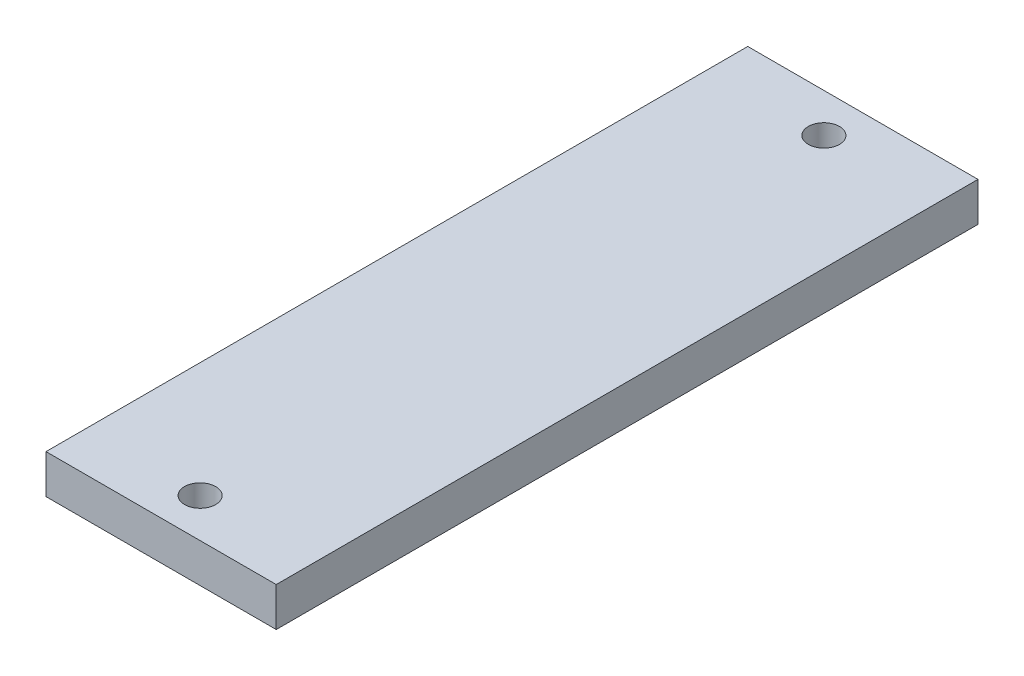
ISO-10303-21;
HEADER;
FILE_DESCRIPTION(('STEP AP214'),'2;1');
FILE_NAME('part.step','',(''),(''),'','','');
FILE_SCHEMA(('AUTOMOTIVE_DESIGN { 1 0 10303 214 1 1 1 1 }'));
ENDSEC;
DATA;
#1=APPLICATION_CONTEXT('core data for automotive mechanical design processes');
#2=APPLICATION_PROTOCOL_DEFINITION('international standard','automotive_design',2000,#1);
#3=PRODUCT_CONTEXT('',#1,'mechanical');
#4=PRODUCT('Part','Part','',(#3));
#5=PRODUCT_RELATED_PRODUCT_CATEGORY('part','',(#4));
#6=PRODUCT_DEFINITION_FORMATION('','',#4);
#7=PRODUCT_DEFINITION_CONTEXT('part definition',#1,'design');
#8=PRODUCT_DEFINITION('design','',#6,#7);
#9=PRODUCT_DEFINITION_SHAPE('','',#8);
#10=(LENGTH_UNIT() NAMED_UNIT(*) SI_UNIT(.MILLI.,.METRE.));
#11=(NAMED_UNIT(*) PLANE_ANGLE_UNIT() SI_UNIT($,.RADIAN.));
#12=(NAMED_UNIT(*) SI_UNIT($,.STERADIAN.) SOLID_ANGLE_UNIT());
#13=UNCERTAINTY_MEASURE_WITH_UNIT(LENGTH_MEASURE(1.E-05),#10,'distance_accuracy_value','');
#14=(GEOMETRIC_REPRESENTATION_CONTEXT(3) GLOBAL_UNCERTAINTY_ASSIGNED_CONTEXT((#13)) GLOBAL_UNIT_ASSIGNED_CONTEXT((#10,
#11,#12)) REPRESENTATION_CONTEXT('',''));
#15=CARTESIAN_POINT('',(0.,0.,0.));
#16=DIRECTION('',(0.,0.,1.));
#17=DIRECTION('',(1.,0.,0.));
#18=AXIS2_PLACEMENT_3D('',#15,#16,#17);
#19=CARTESIAN_POINT('',(18.75,6.35,57.15));
#20=DIRECTION('',(-1.,0.,0.));
#21=DIRECTION('',(0.,0.,1.));
#22=AXIS2_PLACEMENT_3D('',#19,#20,#21);
#23=PLANE('',#22);
#24=DIRECTION('',(0.,0.,-1.));
#25=VECTOR('',#24,1.);
#26=CARTESIAN_POINT('',(18.75,0.,57.15));
#27=LINE('',#26,#25);
#28=CARTESIAN_POINT('',(18.75,0.,57.15));
#29=VERTEX_POINT('',#28);
#30=CARTESIAN_POINT('',(18.75,0.,-57.15));
#31=VERTEX_POINT('',#30);
#32=EDGE_CURVE('E114',#29,#31,#27,.T.);
#33=ORIENTED_EDGE('',*,*,#32,.T.);
#34=DIRECTION('',(0.,-1.,0.));
#35=VECTOR('',#34,1.);
#36=CARTESIAN_POINT('',(18.75,6.35,-57.15));
#37=LINE('',#36,#35);
#38=CARTESIAN_POINT('',(18.75,6.35,-57.15));
#39=VERTEX_POINT('',#38);
#40=EDGE_CURVE('E11',#39,#31,#37,.T.);
#41=ORIENTED_EDGE('',*,*,#40,.F.);
#42=DIRECTION('',(0.,0.,-1.));
#43=VECTOR('',#42,1.);
#44=CARTESIAN_POINT('',(18.75,6.35,57.15));
#45=LINE('',#44,#43);
#46=CARTESIAN_POINT('',(18.75,6.35,57.15));
#47=VERTEX_POINT('',#46);
#48=EDGE_CURVE('E97',#47,#39,#45,.T.);
#49=ORIENTED_EDGE('',*,*,#48,.F.);
#50=DIRECTION('',(0.,-1.,0.));
#51=VECTOR('',#50,1.);
#52=CARTESIAN_POINT('',(18.75,6.35,57.15));
#53=LINE('',#52,#51);
#54=EDGE_CURVE('E110',#47,#29,#53,.T.);
#55=ORIENTED_EDGE('',*,*,#54,.T.);
#56=EDGE_LOOP('',(#33,#41,#49,#55));
#57=FACE_BOUND('',#56,.T.);
#58=ADVANCED_FACE('F43',(#57),#23,.F.);
#59=CARTESIAN_POINT('',(-18.75,6.35,-57.15));
#60=DIRECTION('',(0.,0.,1.));
#61=DIRECTION('',(1.,0.,0.));
#62=AXIS2_PLACEMENT_3D('',#59,#60,#61);
#63=PLANE('',#62);
#64=DIRECTION('',(-1.,0.,0.));
#65=VECTOR('',#64,1.);
#66=CARTESIAN_POINT('',(-18.75,0.,-57.15));
#67=LINE('',#66,#65);
#68=CARTESIAN_POINT('',(-18.75,0.,-57.15));
#69=VERTEX_POINT('',#68);
#70=EDGE_CURVE('E102',#31,#69,#67,.T.);
#71=ORIENTED_EDGE('',*,*,#70,.T.);
#72=DIRECTION('',(0.,-1.,0.));
#73=VECTOR('',#72,1.);
#74=CARTESIAN_POINT('',(-18.75,6.35,-57.15));
#75=LINE('',#74,#73);
#76=CARTESIAN_POINT('',(-18.75,6.35,-57.15));
#77=VERTEX_POINT('',#76);
#78=EDGE_CURVE('E53',#77,#69,#75,.T.);
#79=ORIENTED_EDGE('',*,*,#78,.F.);
#80=DIRECTION('',(-1.,0.,0.));
#81=VECTOR('',#80,1.);
#82=CARTESIAN_POINT('',(-18.75,6.35,-57.15));
#83=LINE('',#82,#81);
#84=EDGE_CURVE('E92',#39,#77,#83,.T.);
#85=ORIENTED_EDGE('',*,*,#84,.F.);
#86=ORIENTED_EDGE('',*,*,#40,.T.);
#87=EDGE_LOOP('',(#71,#79,#85,#86));
#88=FACE_BOUND('',#87,.T.);
#89=ADVANCED_FACE('F101',(#88),#63,.F.);
#90=CARTESIAN_POINT('',(-18.75,6.35,57.15));
#91=DIRECTION('',(1.,0.,0.));
#92=DIRECTION('',(0.,0.,-1.));
#93=AXIS2_PLACEMENT_3D('',#90,#91,#92);
#94=PLANE('',#93);
#95=DIRECTION('',(0.,0.,1.));
#96=VECTOR('',#95,1.);
#97=CARTESIAN_POINT('',(-18.75,0.,57.15));
#98=LINE('',#97,#96);
#99=CARTESIAN_POINT('',(-18.75,0.,57.15));
#100=VERTEX_POINT('',#99);
#101=EDGE_CURVE('E79',#69,#100,#98,.T.);
#102=ORIENTED_EDGE('',*,*,#101,.T.);
#103=DIRECTION('',(0.,-1.,0.));
#104=VECTOR('',#103,1.);
#105=CARTESIAN_POINT('',(-18.75,6.35,57.15));
#106=LINE('',#105,#104);
#107=CARTESIAN_POINT('',(-18.75,6.35,57.15));
#108=VERTEX_POINT('',#107);
#109=EDGE_CURVE('E104',#108,#100,#106,.T.);
#110=ORIENTED_EDGE('',*,*,#109,.F.);
#111=DIRECTION('',(0.,0.,1.));
#112=VECTOR('',#111,1.);
#113=CARTESIAN_POINT('',(-18.75,6.35,57.15));
#114=LINE('',#113,#112);
#115=EDGE_CURVE('E95',#77,#108,#114,.T.);
#116=ORIENTED_EDGE('',*,*,#115,.F.);
#117=ORIENTED_EDGE('',*,*,#78,.T.);
#118=EDGE_LOOP('',(#102,#110,#116,#117));
#119=FACE_BOUND('',#118,.T.);
#120=ADVANCED_FACE('F106',(#119),#94,.F.);
#121=CARTESIAN_POINT('',(-18.75,6.35,57.15));
#122=DIRECTION('',(0.,0.,-1.));
#123=DIRECTION('',(-1.,0.,0.));
#124=AXIS2_PLACEMENT_3D('',#121,#122,#123);
#125=PLANE('',#124);
#126=DIRECTION('',(1.,0.,0.));
#127=VECTOR('',#126,1.);
#128=CARTESIAN_POINT('',(-18.75,0.,57.15));
#129=LINE('',#128,#127);
#130=EDGE_CURVE('E85',#100,#29,#129,.T.);
#131=ORIENTED_EDGE('',*,*,#130,.T.);
#132=ORIENTED_EDGE('',*,*,#54,.F.);
#133=DIRECTION('',(1.,0.,0.));
#134=VECTOR('',#133,1.);
#135=CARTESIAN_POINT('',(-18.75,6.35,57.15));
#136=LINE('',#135,#134);
#137=EDGE_CURVE('E62',#108,#47,#136,.T.);
#138=ORIENTED_EDGE('',*,*,#137,.F.);
#139=ORIENTED_EDGE('',*,*,#109,.T.);
#140=EDGE_LOOP('',(#131,#132,#138,#139));
#141=FACE_BOUND('',#140,.T.);
#142=ADVANCED_FACE('F151',(#141),#125,.F.);
#143=CARTESIAN_POINT('',(0.,6.35,0.));
#144=DIRECTION('',(0.,-1.,0.));
#145=DIRECTION('',(0.,0.,-1.));
#146=AXIS2_PLACEMENT_3D('',#143,#144,#145);
#147=PLANE('',#146);
#148=CARTESIAN_POINT('',(0.,6.35,-50.8));
#149=DIRECTION('',(0.,1.,0.));
#150=DIRECTION('',(0.,0.,1.));
#151=AXIS2_PLACEMENT_3D('',#148,#149,#150);
#152=CIRCLE('',#151,2.54);
#153=CARTESIAN_POINT('',(0.,6.35,-48.26));
#154=VERTEX_POINT('',#153);
#155=EDGE_CURVE('E130',#154,#154,#152,.T.);
#156=ORIENTED_EDGE('',*,*,#155,.F.);
#157=EDGE_LOOP('',(#156));
#158=FACE_BOUND('',#157,.T.);
#159=CARTESIAN_POINT('',(0.,6.35,50.8));
#160=DIRECTION('',(0.,1.,0.));
#161=DIRECTION('',(0.,0.,-1.));
#162=AXIS2_PLACEMENT_3D('',#159,#160,#161);
#163=CIRCLE('',#162,2.54);
#164=CARTESIAN_POINT('',(0.,6.35,53.34));
#165=VERTEX_POINT('',#164);
#166=EDGE_CURVE('E137',#165,#165,#163,.T.);
#167=ORIENTED_EDGE('',*,*,#166,.F.);
#168=EDGE_LOOP('',(#167));
#169=FACE_BOUND('',#168,.T.);
#170=ORIENTED_EDGE('',*,*,#48,.T.);
#171=ORIENTED_EDGE('',*,*,#84,.T.);
#172=ORIENTED_EDGE('',*,*,#115,.T.);
#173=ORIENTED_EDGE('',*,*,#137,.T.);
#174=EDGE_LOOP('',(#170,#171,#172,#173));
#175=FACE_BOUND('',#174,.T.);
#176=ADVANCED_FACE('F93',(#158,#169,#175),#147,.F.);
#177=CARTESIAN_POINT('',(0.,0.,0.));
#178=DIRECTION('',(0.,-1.,0.));
#179=DIRECTION('',(0.,0.,-1.));
#180=AXIS2_PLACEMENT_3D('',#177,#178,#179);
#181=PLANE('',#180);
#182=CARTESIAN_POINT('',(0.,0.,-50.8));
#183=DIRECTION('',(0.,-1.,0.));
#184=DIRECTION('',(0.,0.,-1.));
#185=AXIS2_PLACEMENT_3D('',#182,#183,#184);
#186=CIRCLE('',#185,2.54);
#187=CARTESIAN_POINT('',(0.,0.,-48.26));
#188=VERTEX_POINT('',#187);
#189=EDGE_CURVE('E46',#188,#188,#186,.T.);
#190=ORIENTED_EDGE('',*,*,#189,.F.);
#191=EDGE_LOOP('',(#190));
#192=FACE_BOUND('',#191,.T.);
#193=CARTESIAN_POINT('',(0.,0.,50.8));
#194=DIRECTION('',(0.,-1.,0.));
#195=DIRECTION('',(0.,0.,-1.));
#196=AXIS2_PLACEMENT_3D('',#193,#194,#195);
#197=CIRCLE('',#196,2.54);
#198=CARTESIAN_POINT('',(0.,0.,53.34));
#199=VERTEX_POINT('',#198);
#200=EDGE_CURVE('E127',#199,#199,#197,.T.);
#201=ORIENTED_EDGE('',*,*,#200,.F.);
#202=EDGE_LOOP('',(#201));
#203=FACE_BOUND('',#202,.T.);
#204=ORIENTED_EDGE('',*,*,#32,.F.);
#205=ORIENTED_EDGE('',*,*,#130,.F.);
#206=ORIENTED_EDGE('',*,*,#101,.F.);
#207=ORIENTED_EDGE('',*,*,#70,.F.);
#208=EDGE_LOOP('',(#204,#205,#206,#207));
#209=FACE_BOUND('',#208,.T.);
#210=ADVANCED_FACE('F150',(#192,#203,#209),#181,.T.);
#211=CARTESIAN_POINT('',(0.,-3.175,50.8));
#212=DIRECTION('',(0.,1.,0.));
#213=DIRECTION('',(0.,0.,1.));
#214=AXIS2_PLACEMENT_3D('',#211,#212,#213);
#215=CYLINDRICAL_SURFACE('',#214,2.54);
#216=CARTESIAN_POINT('',(0.,0.,53.34));
#217=CARTESIAN_POINT('',(0.,0.0661458333333336,53.34));
#218=CARTESIAN_POINT('',(0.,0.132291666666667,53.34));
#219=CARTESIAN_POINT('',(0.,0.264583333333334,53.34));
#220=CARTESIAN_POINT('',(0.,0.330729166666667,53.34));
#221=CARTESIAN_POINT('',(0.,0.463020833333334,53.34));
#222=CARTESIAN_POINT('',(0.,0.529166666666667,53.34));
#223=CARTESIAN_POINT('',(0.,0.661458333333334,53.34));
#224=CARTESIAN_POINT('',(0.,0.727604166666667,53.34));
#225=CARTESIAN_POINT('',(0.,0.859895833333333,53.34));
#226=CARTESIAN_POINT('',(0.,0.926041666666667,53.34));
#227=CARTESIAN_POINT('',(0.,1.05833333333333,53.34));
#228=CARTESIAN_POINT('',(0.,1.12447916666667,53.34));
#229=CARTESIAN_POINT('',(0.,1.25677083333333,53.34));
#230=CARTESIAN_POINT('',(0.,1.32291666666667,53.34));
#231=CARTESIAN_POINT('',(0.,1.45520833333333,53.34));
#232=CARTESIAN_POINT('',(0.,1.52135416666667,53.34));
#233=CARTESIAN_POINT('',(0.,1.65364583333333,53.34));
#234=CARTESIAN_POINT('',(0.,1.71979166666667,53.34));
#235=CARTESIAN_POINT('',(0.,1.85208333333333,53.34));
#236=CARTESIAN_POINT('',(0.,1.91822916666667,53.34));
#237=CARTESIAN_POINT('',(0.,2.05052083333333,53.34));
#238=CARTESIAN_POINT('',(0.,2.11666666666667,53.34));
#239=CARTESIAN_POINT('',(0.,2.24895833333333,53.34));
#240=CARTESIAN_POINT('',(0.,2.31510416666667,53.34));
#241=CARTESIAN_POINT('',(0.,2.44739583333333,53.34));
#242=CARTESIAN_POINT('',(0.,2.51354166666667,53.34));
#243=CARTESIAN_POINT('',(0.,2.64583333333333,53.34));
#244=CARTESIAN_POINT('',(0.,2.71197916666667,53.34));
#245=CARTESIAN_POINT('',(0.,2.84427083333333,53.34));
#246=CARTESIAN_POINT('',(0.,2.91041666666667,53.34));
#247=CARTESIAN_POINT('',(0.,3.04270833333333,53.34));
#248=CARTESIAN_POINT('',(0.,3.10885416666667,53.34));
#249=CARTESIAN_POINT('',(0.,3.24114583333333,53.34));
#250=CARTESIAN_POINT('',(0.,3.30729166666667,53.34));
#251=CARTESIAN_POINT('',(0.,3.43958333333333,53.34));
#252=CARTESIAN_POINT('',(0.,3.50572916666667,53.34));
#253=CARTESIAN_POINT('',(0.,3.63802083333333,53.34));
#254=CARTESIAN_POINT('',(0.,3.70416666666667,53.34));
#255=CARTESIAN_POINT('',(0.,3.83645833333333,53.34));
#256=CARTESIAN_POINT('',(0.,3.90260416666667,53.34));
#257=CARTESIAN_POINT('',(0.,4.03489583333333,53.34));
#258=CARTESIAN_POINT('',(0.,4.10104166666667,53.34));
#259=CARTESIAN_POINT('',(0.,4.23333333333333,53.34));
#260=CARTESIAN_POINT('',(0.,4.29947916666667,53.34));
#261=CARTESIAN_POINT('',(0.,4.43177083333333,53.34));
#262=CARTESIAN_POINT('',(0.,4.49791666666667,53.34));
#263=CARTESIAN_POINT('',(0.,4.63020833333333,53.34));
#264=CARTESIAN_POINT('',(0.,4.69635416666667,53.34));
#265=CARTESIAN_POINT('',(0.,4.82864583333333,53.34));
#266=CARTESIAN_POINT('',(0.,4.89479166666667,53.34));
#267=CARTESIAN_POINT('',(0.,5.02708333333333,53.34));
#268=CARTESIAN_POINT('',(0.,5.09322916666667,53.34));
#269=CARTESIAN_POINT('',(0.,5.22552083333333,53.34));
#270=CARTESIAN_POINT('',(0.,5.29166666666667,53.34));
#271=CARTESIAN_POINT('',(0.,5.42395833333333,53.34));
#272=CARTESIAN_POINT('',(0.,5.49010416666667,53.34));
#273=CARTESIAN_POINT('',(0.,5.62239583333333,53.34));
#274=CARTESIAN_POINT('',(0.,5.68854166666667,53.34));
#275=CARTESIAN_POINT('',(0.,5.82083333333333,53.34));
#276=CARTESIAN_POINT('',(0.,5.88697916666667,53.34));
#277=CARTESIAN_POINT('',(0.,6.01927083333333,53.34));
#278=CARTESIAN_POINT('',(0.,6.08541666666667,53.34));
#279=CARTESIAN_POINT('',(0.,6.21770833333333,53.34));
#280=CARTESIAN_POINT('',(0.,6.28385416666667,53.34));
#281=CARTESIAN_POINT('',(0.,6.35,53.34));
#282=B_SPLINE_CURVE_WITH_KNOTS('',3,(#216,#217,#218,#219,#220,#221,#222,#223,#224,#225,#226,
#227,#228,#229,#230,#231,#232,#233,#234,#235,#236,#237,#238,#239,#240,#241,#242,#243,#244,#245,
#246,#247,#248,#249,#250,#251,#252,#253,#254,#255,#256,#257,#258,#259,#260,#261,#262,#263,#264,
#265,#266,#267,#268,#269,#270,#271,#272,#273,#274,#275,#276,#277,#278,#279,#280,#281),
.UNSPECIFIED.,.F.,.F.,(4,2,2,2,2,2,2,2,2,2,2,2,2,2,2,2,2,2,2,2,2,2,2,2,2,2,2,2,2,2,2,2,4),(0.,
0.1984375,0.396875,0.5953125,0.79375,0.9921875,1.190625,1.3890625,1.5875,1.7859375,1.984375,
2.1828125,2.38125,2.5796875,2.778125,2.9765625,3.175,3.3734375,3.571875,3.7703125,3.96875,
4.1671875,4.365625,4.5640625,4.7625,4.9609375,5.159375,5.3578125,5.55625,5.7546875,5.953125,
6.1515625,6.35),.UNSPECIFIED.);
#283=EDGE_CURVE('BSEAM147',#199,#165,#282,.T.);
#284=ORIENTED_EDGE('',*,*,#200,.T.);
#285=ORIENTED_EDGE('',*,*,#166,.T.);
#286=ORIENTED_EDGE('',*,*,#283,.T.);
#287=ORIENTED_EDGE('',*,*,#283,.F.);
#288=EDGE_LOOP('',(#284,#286,#285,#287));
#289=FACE_BOUND('',#288,.T.);
#290=ADVANCED_FACE('F147',(#289),#215,.F.);
#291=CARTESIAN_POINT('',(0.,-3.175,-50.8));
#292=DIRECTION('',(0.,1.,0.));
#293=DIRECTION('',(0.,0.,1.));
#294=AXIS2_PLACEMENT_3D('',#291,#292,#293);
#295=CYLINDRICAL_SURFACE('',#294,2.54);
#296=CARTESIAN_POINT('',(0.,0.,-48.26));
#297=CARTESIAN_POINT('',(0.,0.0661458333333336,-48.26));
#298=CARTESIAN_POINT('',(0.,0.132291666666667,-48.26));
#299=CARTESIAN_POINT('',(0.,0.264583333333334,-48.26));
#300=CARTESIAN_POINT('',(0.,0.330729166666667,-48.26));
#301=CARTESIAN_POINT('',(0.,0.463020833333334,-48.26));
#302=CARTESIAN_POINT('',(0.,0.529166666666667,-48.26));
#303=CARTESIAN_POINT('',(0.,0.661458333333334,-48.26));
#304=CARTESIAN_POINT('',(0.,0.727604166666667,-48.26));
#305=CARTESIAN_POINT('',(0.,0.859895833333333,-48.26));
#306=CARTESIAN_POINT('',(0.,0.926041666666667,-48.26));
#307=CARTESIAN_POINT('',(0.,1.05833333333333,-48.26));
#308=CARTESIAN_POINT('',(0.,1.12447916666667,-48.26));
#309=CARTESIAN_POINT('',(0.,1.25677083333333,-48.26));
#310=CARTESIAN_POINT('',(0.,1.32291666666667,-48.26));
#311=CARTESIAN_POINT('',(0.,1.45520833333333,-48.26));
#312=CARTESIAN_POINT('',(0.,1.52135416666667,-48.26));
#313=CARTESIAN_POINT('',(0.,1.65364583333333,-48.26));
#314=CARTESIAN_POINT('',(0.,1.71979166666667,-48.26));
#315=CARTESIAN_POINT('',(0.,1.85208333333333,-48.26));
#316=CARTESIAN_POINT('',(0.,1.91822916666667,-48.26));
#317=CARTESIAN_POINT('',(0.,2.05052083333333,-48.26));
#318=CARTESIAN_POINT('',(0.,2.11666666666667,-48.26));
#319=CARTESIAN_POINT('',(0.,2.24895833333333,-48.26));
#320=CARTESIAN_POINT('',(0.,2.31510416666667,-48.26));
#321=CARTESIAN_POINT('',(0.,2.44739583333333,-48.26));
#322=CARTESIAN_POINT('',(0.,2.51354166666667,-48.26));
#323=CARTESIAN_POINT('',(0.,2.64583333333333,-48.26));
#324=CARTESIAN_POINT('',(0.,2.71197916666667,-48.26));
#325=CARTESIAN_POINT('',(0.,2.84427083333333,-48.26));
#326=CARTESIAN_POINT('',(0.,2.91041666666667,-48.26));
#327=CARTESIAN_POINT('',(0.,3.04270833333333,-48.26));
#328=CARTESIAN_POINT('',(0.,3.10885416666667,-48.26));
#329=CARTESIAN_POINT('',(0.,3.24114583333333,-48.26));
#330=CARTESIAN_POINT('',(0.,3.30729166666667,-48.26));
#331=CARTESIAN_POINT('',(0.,3.43958333333333,-48.26));
#332=CARTESIAN_POINT('',(0.,3.50572916666667,-48.26));
#333=CARTESIAN_POINT('',(0.,3.63802083333333,-48.26));
#334=CARTESIAN_POINT('',(0.,3.70416666666667,-48.26));
#335=CARTESIAN_POINT('',(0.,3.83645833333333,-48.26));
#336=CARTESIAN_POINT('',(0.,3.90260416666667,-48.26));
#337=CARTESIAN_POINT('',(0.,4.03489583333333,-48.26));
#338=CARTESIAN_POINT('',(0.,4.10104166666667,-48.26));
#339=CARTESIAN_POINT('',(0.,4.23333333333333,-48.26));
#340=CARTESIAN_POINT('',(0.,4.29947916666667,-48.26));
#341=CARTESIAN_POINT('',(0.,4.43177083333333,-48.26));
#342=CARTESIAN_POINT('',(0.,4.49791666666667,-48.26));
#343=CARTESIAN_POINT('',(0.,4.63020833333333,-48.26));
#344=CARTESIAN_POINT('',(0.,4.69635416666667,-48.26));
#345=CARTESIAN_POINT('',(0.,4.82864583333333,-48.26));
#346=CARTESIAN_POINT('',(0.,4.89479166666667,-48.26));
#347=CARTESIAN_POINT('',(0.,5.02708333333333,-48.26));
#348=CARTESIAN_POINT('',(0.,5.09322916666667,-48.26));
#349=CARTESIAN_POINT('',(0.,5.22552083333333,-48.26));
#350=CARTESIAN_POINT('',(0.,5.29166666666667,-48.26));
#351=CARTESIAN_POINT('',(0.,5.42395833333333,-48.26));
#352=CARTESIAN_POINT('',(0.,5.49010416666667,-48.26));
#353=CARTESIAN_POINT('',(0.,5.62239583333333,-48.26));
#354=CARTESIAN_POINT('',(0.,5.68854166666667,-48.26));
#355=CARTESIAN_POINT('',(0.,5.82083333333333,-48.26));
#356=CARTESIAN_POINT('',(0.,5.88697916666667,-48.26));
#357=CARTESIAN_POINT('',(0.,6.01927083333333,-48.26));
#358=CARTESIAN_POINT('',(0.,6.08541666666667,-48.26));
#359=CARTESIAN_POINT('',(0.,6.21770833333333,-48.26));
#360=CARTESIAN_POINT('',(0.,6.28385416666667,-48.26));
#361=CARTESIAN_POINT('',(0.,6.35,-48.26));
#362=B_SPLINE_CURVE_WITH_KNOTS('',3,(#296,#297,#298,#299,#300,#301,#302,#303,#304,#305,#306,
#307,#308,#309,#310,#311,#312,#313,#314,#315,#316,#317,#318,#319,#320,#321,#322,#323,#324,#325,
#326,#327,#328,#329,#330,#331,#332,#333,#334,#335,#336,#337,#338,#339,#340,#341,#342,#343,#344,
#345,#346,#347,#348,#349,#350,#351,#352,#353,#354,#355,#356,#357,#358,#359,#360,#361),
.UNSPECIFIED.,.F.,.F.,(4,2,2,2,2,2,2,2,2,2,2,2,2,2,2,2,2,2,2,2,2,2,2,2,2,2,2,2,2,2,2,2,4),(0.,
0.1984375,0.396875,0.5953125,0.79375,0.9921875,1.190625,1.3890625,1.5875,1.7859375,1.984375,
2.1828125,2.38125,2.5796875,2.778125,2.9765625,3.175,3.3734375,3.571875,3.7703125,3.96875,
4.1671875,4.365625,4.5640625,4.7625,4.9609375,5.159375,5.3578125,5.55625,5.7546875,5.953125,
6.1515625,6.35),.UNSPECIFIED.);
#363=EDGE_CURVE('BSEAM201',#188,#154,#362,.T.);
#364=ORIENTED_EDGE('',*,*,#189,.T.);
#365=ORIENTED_EDGE('',*,*,#155,.T.);
#366=ORIENTED_EDGE('',*,*,#363,.T.);
#367=ORIENTED_EDGE('',*,*,#363,.F.);
#368=EDGE_LOOP('',(#364,#366,#365,#367));
#369=FACE_BOUND('',#368,.T.);
#370=ADVANCED_FACE('F201',(#369),#295,.F.);
#371=CLOSED_SHELL('',(#58,#89,#120,#142,#176,#210,#290,#370));
#372=MANIFOLD_SOLID_BREP('B2',#371);
#373=ADVANCED_BREP_SHAPE_REPRESENTATION('',(#18,#372),#14);
#374=SHAPE_DEFINITION_REPRESENTATION(#9,#373);
ENDSEC;
END-ISO-10303-21;
